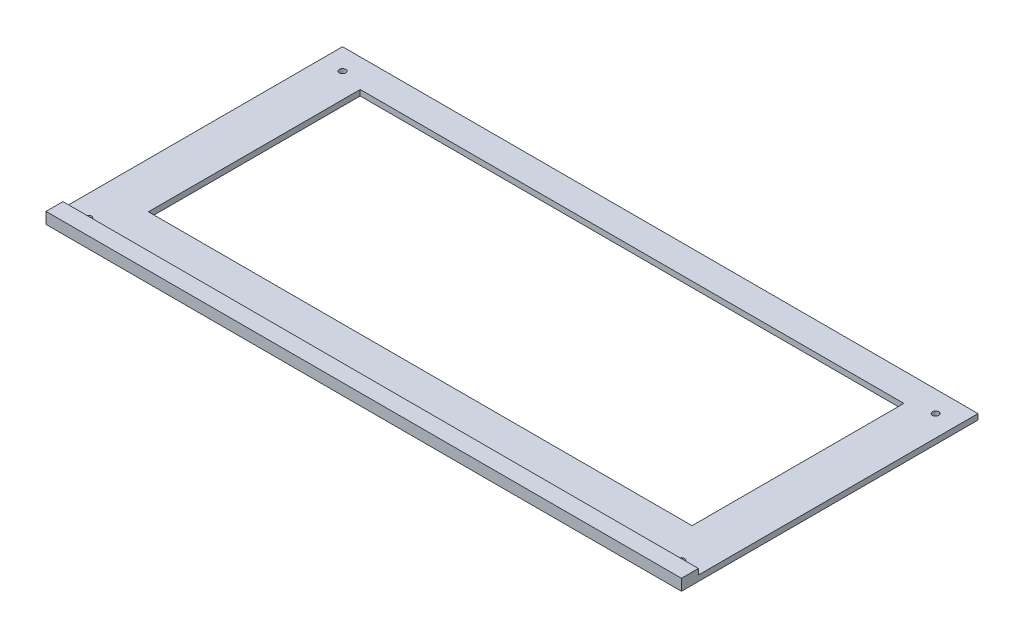
ISO-10303-21;
HEADER;
FILE_DESCRIPTION(('STEP AP214'),'2;1');
FILE_NAME('part.step','',(''),(''),'','','');
FILE_SCHEMA(('AUTOMOTIVE_DESIGN { 1 0 10303 214 1 1 1 1 }'));
ENDSEC;
DATA;
#1=APPLICATION_CONTEXT('core data for automotive mechanical design processes');
#2=APPLICATION_PROTOCOL_DEFINITION('international standard','automotive_design',2000,#1);
#3=PRODUCT_CONTEXT('',#1,'mechanical');
#4=PRODUCT('Part','Part','',(#3));
#5=PRODUCT_RELATED_PRODUCT_CATEGORY('part','',(#4));
#6=PRODUCT_DEFINITION_FORMATION('','',#4);
#7=PRODUCT_DEFINITION_CONTEXT('part definition',#1,'design');
#8=PRODUCT_DEFINITION('design','',#6,#7);
#9=PRODUCT_DEFINITION_SHAPE('','',#8);
#10=(LENGTH_UNIT() NAMED_UNIT(*) SI_UNIT(.MILLI.,.METRE.));
#11=(NAMED_UNIT(*) PLANE_ANGLE_UNIT() SI_UNIT($,.RADIAN.));
#12=(NAMED_UNIT(*) SI_UNIT($,.STERADIAN.) SOLID_ANGLE_UNIT());
#13=UNCERTAINTY_MEASURE_WITH_UNIT(LENGTH_MEASURE(1.E-05),#10,'distance_accuracy_value','');
#14=(GEOMETRIC_REPRESENTATION_CONTEXT(3) GLOBAL_UNCERTAINTY_ASSIGNED_CONTEXT((#13)) GLOBAL_UNIT_ASSIGNED_CONTEXT((#10,
#11,#12)) REPRESENTATION_CONTEXT('',''));
#15=CARTESIAN_POINT('',(0.,0.,0.));
#16=DIRECTION('',(0.,0.,1.));
#17=DIRECTION('',(1.,0.,0.));
#18=AXIS2_PLACEMENT_3D('',#15,#16,#17);
#19=CARTESIAN_POINT('',(0.,8.,0.));
#20=DIRECTION('',(0.,-1.,0.));
#21=DIRECTION('',(0.,0.,-1.));
#22=AXIS2_PLACEMENT_3D('',#19,#20,#21);
#23=PLANE('',#22);
#24=CARTESIAN_POINT('',(420.,8.,-180.));
#25=DIRECTION('',(0.,1.,0.));
#26=DIRECTION('',(0.,0.,1.));
#27=AXIS2_PLACEMENT_3D('',#24,#25,#26);
#28=CIRCLE('',#27,4.50000000000002);
#29=CARTESIAN_POINT('',(420.,8.,-175.5));
#30=VERTEX_POINT('',#29);
#31=EDGE_CURVE('E143',#30,#30,#28,.T.);
#32=ORIENTED_EDGE('',*,*,#31,.F.);
#33=EDGE_LOOP('',(#32));
#34=FACE_BOUND('',#33,.T.);
#35=CARTESIAN_POINT('',(-420.,8.,-180.));
#36=DIRECTION('',(0.,1.,0.));
#37=DIRECTION('',(0.,0.,1.));
#38=AXIS2_PLACEMENT_3D('',#35,#36,#37);
#39=CIRCLE('',#38,4.50000000000002);
#40=CARTESIAN_POINT('',(-420.,8.,-175.5));
#41=VERTEX_POINT('',#40);
#42=EDGE_CURVE('E149',#41,#41,#39,.T.);
#43=ORIENTED_EDGE('',*,*,#42,.F.);
#44=EDGE_LOOP('',(#43));
#45=FACE_BOUND('',#44,.T.);
#46=CARTESIAN_POINT('',(420.,8.,180.));
#47=DIRECTION('',(0.,1.,0.));
#48=DIRECTION('',(0.,0.,1.));
#49=AXIS2_PLACEMENT_3D('',#46,#47,#48);
#50=CIRCLE('',#49,4.50000000000002);
#51=CARTESIAN_POINT('',(420.,8.,184.5));
#52=VERTEX_POINT('',#51);
#53=EDGE_CURVE('E155',#52,#52,#50,.T.);
#54=ORIENTED_EDGE('',*,*,#53,.F.);
#55=EDGE_LOOP('',(#54));
#56=FACE_BOUND('',#55,.T.);
#57=CARTESIAN_POINT('',(-420.,8.,180.));
#58=DIRECTION('',(0.,1.,0.));
#59=DIRECTION('',(0.,0.,1.));
#60=AXIS2_PLACEMENT_3D('',#57,#58,#59);
#61=CIRCLE('',#60,4.50000000000002);
#62=CARTESIAN_POINT('',(-420.,8.,184.5));
#63=VERTEX_POINT('',#62);
#64=EDGE_CURVE('E161',#63,#63,#61,.T.);
#65=ORIENTED_EDGE('',*,*,#64,.F.);
#66=EDGE_LOOP('',(#65));
#67=FACE_BOUND('',#66,.T.);
#68=DIRECTION('',(0.,0.,-1.));
#69=VECTOR('',#68,1.);
#70=CARTESIAN_POINT('',(385.,8.,130.));
#71=LINE('',#70,#69);
#72=CARTESIAN_POINT('',(385.,8.,130.));
#73=VERTEX_POINT('',#72);
#74=CARTESIAN_POINT('',(385.,8.,-170.));
#75=VERTEX_POINT('',#74);
#76=EDGE_CURVE('E167',#73,#75,#71,.T.);
#77=ORIENTED_EDGE('',*,*,#76,.F.);
#78=DIRECTION('',(1.,0.,0.));
#79=VECTOR('',#78,1.);
#80=CARTESIAN_POINT('',(-385.,8.,130.));
#81=LINE('',#80,#79);
#82=CARTESIAN_POINT('',(-385.,8.,130.));
#83=VERTEX_POINT('',#82);
#84=EDGE_CURVE('E175',#83,#73,#81,.T.);
#85=ORIENTED_EDGE('',*,*,#84,.F.);
#86=DIRECTION('',(0.,0.,1.));
#87=VECTOR('',#86,1.);
#88=CARTESIAN_POINT('',(-385.,8.,130.));
#89=LINE('',#88,#87);
#90=CARTESIAN_POINT('',(-385.,8.,-170.));
#91=VERTEX_POINT('',#90);
#92=EDGE_CURVE('E172',#91,#83,#89,.T.);
#93=ORIENTED_EDGE('',*,*,#92,.F.);
#94=DIRECTION('',(-1.,0.,0.));
#95=VECTOR('',#94,1.);
#96=CARTESIAN_POINT('',(-385.,8.,-170.));
#97=LINE('',#96,#95);
#98=EDGE_CURVE('E169',#75,#91,#97,.T.);
#99=ORIENTED_EDGE('',*,*,#98,.F.);
#100=EDGE_LOOP('',(#77,#85,#93,#99));
#101=FACE_BOUND('',#100,.T.);
#102=DIRECTION('',(-1.,0.,0.));
#103=VECTOR('',#102,1.);
#104=CARTESIAN_POINT('',(0.,8.,186.));
#105=LINE('',#104,#103);
#106=CARTESIAN_POINT('',(450.,8.,186.));
#107=VERTEX_POINT('',#106);
#108=CARTESIAN_POINT('',(-450.,8.,186.));
#109=VERTEX_POINT('',#108);
#110=EDGE_CURVE('E54',#107,#109,#105,.T.);
#111=ORIENTED_EDGE('',*,*,#110,.F.);
#112=DIRECTION('',(0.,0.,-1.));
#113=VECTOR('',#112,1.);
#114=CARTESIAN_POINT('',(450.,8.,210.));
#115=LINE('',#114,#113);
#116=CARTESIAN_POINT('',(450.,8.,-210.));
#117=VERTEX_POINT('',#116);
#118=EDGE_CURVE('E136',#107,#117,#115,.T.);
#119=ORIENTED_EDGE('',*,*,#118,.T.);
#120=DIRECTION('',(-1.,0.,0.));
#121=VECTOR('',#120,1.);
#122=CARTESIAN_POINT('',(-450.,8.,-210.));
#123=LINE('',#122,#121);
#124=CARTESIAN_POINT('',(-450.,8.,-210.));
#125=VERTEX_POINT('',#124);
#126=EDGE_CURVE('E199',#117,#125,#123,.T.);
#127=ORIENTED_EDGE('',*,*,#126,.T.);
#128=DIRECTION('',(0.,0.,1.));
#129=VECTOR('',#128,1.);
#130=CARTESIAN_POINT('',(-450.,8.,210.));
#131=LINE('',#130,#129);
#132=EDGE_CURVE('E59',#125,#109,#131,.T.);
#133=ORIENTED_EDGE('',*,*,#132,.T.);
#134=EDGE_LOOP('',(#111,#119,#127,#133));
#135=FACE_BOUND('',#134,.T.);
#136=ADVANCED_FACE('F39',(#34,#45,#56,#67,#101,#135),#23,.F.);
#137=CARTESIAN_POINT('',(0.,0.,0.));
#138=DIRECTION('',(0.,-1.,0.));
#139=DIRECTION('',(0.,0.,-1.));
#140=AXIS2_PLACEMENT_3D('',#137,#138,#139);
#141=PLANE('',#140);
#142=DIRECTION('',(1.,0.,0.));
#143=VECTOR('',#142,1.);
#144=CARTESIAN_POINT('',(-450.,0.,210.));
#145=LINE('',#144,#143);
#146=CARTESIAN_POINT('',(-450.,0.,210.));
#147=VERTEX_POINT('',#146);
#148=CARTESIAN_POINT('',(450.,0.,210.));
#149=VERTEX_POINT('',#148);
#150=EDGE_CURVE('E200',#147,#149,#145,.T.);
#151=ORIENTED_EDGE('',*,*,#150,.F.);
#152=DIRECTION('',(0.,0.,1.));
#153=VECTOR('',#152,1.);
#154=CARTESIAN_POINT('',(-450.,0.,210.));
#155=LINE('',#154,#153);
#156=CARTESIAN_POINT('',(-450.,0.,-210.));
#157=VERTEX_POINT('',#156);
#158=EDGE_CURVE('E207',#157,#147,#155,.T.);
#159=ORIENTED_EDGE('',*,*,#158,.F.);
#160=DIRECTION('',(-1.,0.,0.));
#161=VECTOR('',#160,1.);
#162=CARTESIAN_POINT('',(-450.,0.,-210.));
#163=LINE('',#162,#161);
#164=CARTESIAN_POINT('',(450.,0.,-210.));
#165=VERTEX_POINT('',#164);
#166=EDGE_CURVE('E205',#165,#157,#163,.T.);
#167=ORIENTED_EDGE('',*,*,#166,.F.);
#168=DIRECTION('',(0.,0.,-1.));
#169=VECTOR('',#168,1.);
#170=CARTESIAN_POINT('',(450.,0.,210.));
#171=LINE('',#170,#169);
#172=EDGE_CURVE('E197',#149,#165,#171,.T.);
#173=ORIENTED_EDGE('',*,*,#172,.F.);
#174=EDGE_LOOP('',(#151,#159,#167,#173));
#175=FACE_BOUND('',#174,.T.);
#176=CARTESIAN_POINT('',(-420.,0.,-180.));
#177=DIRECTION('',(0.,1.,0.));
#178=DIRECTION('',(0.,0.,1.));
#179=AXIS2_PLACEMENT_3D('',#176,#177,#178);
#180=CIRCLE('',#179,4.50000000000002);
#181=CARTESIAN_POINT('',(-420.,0.,-175.5));
#182=VERTEX_POINT('',#181);
#183=EDGE_CURVE('E146',#182,#182,#180,.T.);
#184=ORIENTED_EDGE('',*,*,#183,.T.);
#185=EDGE_LOOP('',(#184));
#186=FACE_BOUND('',#185,.T.);
#187=CARTESIAN_POINT('',(-420.,0.,180.));
#188=DIRECTION('',(0.,1.,0.));
#189=DIRECTION('',(0.,0.,1.));
#190=AXIS2_PLACEMENT_3D('',#187,#188,#189);
#191=CIRCLE('',#190,4.50000000000002);
#192=CARTESIAN_POINT('',(-420.,0.,184.5));
#193=VERTEX_POINT('',#192);
#194=EDGE_CURVE('E158',#193,#193,#191,.T.);
#195=ORIENTED_EDGE('',*,*,#194,.T.);
#196=EDGE_LOOP('',(#195));
#197=FACE_BOUND('',#196,.T.);
#198=DIRECTION('',(1.,0.,0.));
#199=VECTOR('',#198,1.);
#200=CARTESIAN_POINT('',(-385.,0.,130.));
#201=LINE('',#200,#199);
#202=CARTESIAN_POINT('',(-385.,0.,130.));
#203=VERTEX_POINT('',#202);
#204=CARTESIAN_POINT('',(385.,0.,130.));
#205=VERTEX_POINT('',#204);
#206=EDGE_CURVE('E170',#203,#205,#201,.T.);
#207=ORIENTED_EDGE('',*,*,#206,.T.);
#208=DIRECTION('',(0.,0.,-1.));
#209=VECTOR('',#208,1.);
#210=CARTESIAN_POINT('',(385.,0.,130.));
#211=LINE('',#210,#209);
#212=CARTESIAN_POINT('',(385.,0.,-170.));
#213=VERTEX_POINT('',#212);
#214=EDGE_CURVE('E164',#205,#213,#211,.T.);
#215=ORIENTED_EDGE('',*,*,#214,.T.);
#216=DIRECTION('',(-1.,0.,0.));
#217=VECTOR('',#216,1.);
#218=CARTESIAN_POINT('',(-385.,0.,-170.));
#219=LINE('',#218,#217);
#220=CARTESIAN_POINT('',(-385.,0.,-170.));
#221=VERTEX_POINT('',#220);
#222=EDGE_CURVE('E180',#213,#221,#219,.T.);
#223=ORIENTED_EDGE('',*,*,#222,.T.);
#224=DIRECTION('',(0.,0.,1.));
#225=VECTOR('',#224,1.);
#226=CARTESIAN_POINT('',(-385.,0.,130.));
#227=LINE('',#226,#225);
#228=EDGE_CURVE('E183',#221,#203,#227,.T.);
#229=ORIENTED_EDGE('',*,*,#228,.T.);
#230=EDGE_LOOP('',(#207,#215,#223,#229));
#231=FACE_BOUND('',#230,.T.);
#232=CARTESIAN_POINT('',(420.,0.,180.));
#233=DIRECTION('',(0.,1.,0.));
#234=DIRECTION('',(0.,0.,1.));
#235=AXIS2_PLACEMENT_3D('',#232,#233,#234);
#236=CIRCLE('',#235,4.50000000000002);
#237=CARTESIAN_POINT('',(420.,0.,184.5));
#238=VERTEX_POINT('',#237);
#239=EDGE_CURVE('E152',#238,#238,#236,.T.);
#240=ORIENTED_EDGE('',*,*,#239,.T.);
#241=EDGE_LOOP('',(#240));
#242=FACE_BOUND('',#241,.T.);
#243=CARTESIAN_POINT('',(420.,0.,-180.));
#244=DIRECTION('',(0.,1.,0.));
#245=DIRECTION('',(0.,0.,1.));
#246=AXIS2_PLACEMENT_3D('',#243,#244,#245);
#247=CIRCLE('',#246,4.50000000000002);
#248=CARTESIAN_POINT('',(420.,0.,-175.5));
#249=VERTEX_POINT('',#248);
#250=EDGE_CURVE('E138',#249,#249,#247,.T.);
#251=ORIENTED_EDGE('',*,*,#250,.T.);
#252=EDGE_LOOP('',(#251));
#253=FACE_BOUND('',#252,.T.);
#254=ADVANCED_FACE('F223',(#175,#186,#197,#231,#242,#253),#141,.T.);
#255=CARTESIAN_POINT('',(450.,8.,210.));
#256=DIRECTION('',(-1.,0.,0.));
#257=DIRECTION('',(0.,0.,1.));
#258=AXIS2_PLACEMENT_3D('',#255,#256,#257);
#259=PLANE('',#258);
#260=ORIENTED_EDGE('',*,*,#172,.T.);
#261=DIRECTION('',(0.,-1.,0.));
#262=VECTOR('',#261,1.);
#263=CARTESIAN_POINT('',(450.,8.,-210.));
#264=LINE('',#263,#262);
#265=EDGE_CURVE('E11',#117,#165,#264,.T.);
#266=ORIENTED_EDGE('',*,*,#265,.F.);
#267=ORIENTED_EDGE('',*,*,#118,.F.);
#268=DIRECTION('',(0.,-1.,0.));
#269=VECTOR('',#268,1.);
#270=CARTESIAN_POINT('',(450.,16.,186.));
#271=LINE('',#270,#269);
#272=CARTESIAN_POINT('',(450.,16.,186.));
#273=VERTEX_POINT('',#272);
#274=EDGE_CURVE('E118',#273,#107,#271,.T.);
#275=ORIENTED_EDGE('',*,*,#274,.F.);
#276=DIRECTION('',(0.,0.,-1.));
#277=VECTOR('',#276,1.);
#278=CARTESIAN_POINT('',(450.,16.,210.));
#279=LINE('',#278,#277);
#280=CARTESIAN_POINT('',(450.,16.,210.));
#281=VERTEX_POINT('',#280);
#282=EDGE_CURVE('E125',#281,#273,#279,.T.);
#283=ORIENTED_EDGE('',*,*,#282,.F.);
#284=DIRECTION('',(0.,-1.,0.));
#285=VECTOR('',#284,1.);
#286=CARTESIAN_POINT('',(450.,8.,210.));
#287=LINE('',#286,#285);
#288=EDGE_CURVE('E203',#281,#149,#287,.T.);
#289=ORIENTED_EDGE('',*,*,#288,.T.);
#290=EDGE_LOOP('',(#260,#266,#267,#275,#283,#289));
#291=FACE_BOUND('',#290,.T.);
#292=ADVANCED_FACE('F41',(#291),#259,.F.);
#293=CARTESIAN_POINT('',(-450.,8.,-210.));
#294=DIRECTION('',(0.,0.,1.));
#295=DIRECTION('',(1.,0.,0.));
#296=AXIS2_PLACEMENT_3D('',#293,#294,#295);
#297=PLANE('',#296);
#298=ORIENTED_EDGE('',*,*,#166,.T.);
#299=DIRECTION('',(0.,-1.,0.));
#300=VECTOR('',#299,1.);
#301=CARTESIAN_POINT('',(-450.,8.,-210.));
#302=LINE('',#301,#300);
#303=EDGE_CURVE('E47',#125,#157,#302,.T.);
#304=ORIENTED_EDGE('',*,*,#303,.F.);
#305=ORIENTED_EDGE('',*,*,#126,.F.);
#306=ORIENTED_EDGE('',*,*,#265,.T.);
#307=EDGE_LOOP('',(#298,#304,#305,#306));
#308=FACE_BOUND('',#307,.T.);
#309=ADVANCED_FACE('F228',(#308),#297,.F.);
#310=CARTESIAN_POINT('',(-450.,8.,210.));
#311=DIRECTION('',(1.,0.,0.));
#312=DIRECTION('',(0.,0.,-1.));
#313=AXIS2_PLACEMENT_3D('',#310,#311,#312);
#314=PLANE('',#313);
#315=DIRECTION('',(0.,-1.,0.));
#316=VECTOR('',#315,1.);
#317=CARTESIAN_POINT('',(-450.,8.,210.));
#318=LINE('',#317,#316);
#319=CARTESIAN_POINT('',(-450.,16.,210.));
#320=VERTEX_POINT('',#319);
#321=EDGE_CURVE('E211',#320,#147,#318,.T.);
#322=ORIENTED_EDGE('',*,*,#321,.F.);
#323=DIRECTION('',(0.,0.,1.));
#324=VECTOR('',#323,1.);
#325=CARTESIAN_POINT('',(-450.,16.,210.));
#326=LINE('',#325,#324);
#327=CARTESIAN_POINT('',(-450.,16.,186.));
#328=VERTEX_POINT('',#327);
#329=EDGE_CURVE('E124',#328,#320,#326,.T.);
#330=ORIENTED_EDGE('',*,*,#329,.F.);
#331=DIRECTION('',(0.,-1.,0.));
#332=VECTOR('',#331,1.);
#333=CARTESIAN_POINT('',(-450.,16.,186.));
#334=LINE('',#333,#332);
#335=EDGE_CURVE('E120',#328,#109,#334,.T.);
#336=ORIENTED_EDGE('',*,*,#335,.T.);
#337=ORIENTED_EDGE('',*,*,#132,.F.);
#338=ORIENTED_EDGE('',*,*,#303,.T.);
#339=ORIENTED_EDGE('',*,*,#158,.T.);
#340=EDGE_LOOP('',(#322,#330,#336,#337,#338,#339));
#341=FACE_BOUND('',#340,.T.);
#342=ADVANCED_FACE('F217',(#341),#314,.F.);
#343=CARTESIAN_POINT('',(-450.,8.,210.));
#344=DIRECTION('',(0.,0.,-1.));
#345=DIRECTION('',(-1.,0.,0.));
#346=AXIS2_PLACEMENT_3D('',#343,#344,#345);
#347=PLANE('',#346);
#348=ORIENTED_EDGE('',*,*,#150,.T.);
#349=ORIENTED_EDGE('',*,*,#288,.F.);
#350=DIRECTION('',(1.,0.,0.));
#351=VECTOR('',#350,1.);
#352=CARTESIAN_POINT('',(-450.,16.,210.));
#353=LINE('',#352,#351);
#354=EDGE_CURVE('E131',#320,#281,#353,.T.);
#355=ORIENTED_EDGE('',*,*,#354,.F.);
#356=ORIENTED_EDGE('',*,*,#321,.T.);
#357=EDGE_LOOP('',(#348,#349,#355,#356));
#358=FACE_BOUND('',#357,.T.);
#359=ADVANCED_FACE('F227',(#358),#347,.F.);
#360=CARTESIAN_POINT('',(385.,8.,130.));
#361=DIRECTION('',(-1.,0.,0.));
#362=DIRECTION('',(0.,0.,1.));
#363=AXIS2_PLACEMENT_3D('',#360,#361,#362);
#364=PLANE('',#363);
#365=ORIENTED_EDGE('',*,*,#214,.F.);
#366=DIRECTION('',(0.,-1.,0.));
#367=VECTOR('',#366,1.);
#368=CARTESIAN_POINT('',(385.,8.,130.));
#369=LINE('',#368,#367);
#370=EDGE_CURVE('E177',#73,#205,#369,.T.);
#371=ORIENTED_EDGE('',*,*,#370,.F.);
#372=ORIENTED_EDGE('',*,*,#76,.T.);
#373=DIRECTION('',(0.,-1.,0.));
#374=VECTOR('',#373,1.);
#375=CARTESIAN_POINT('',(385.,8.,-170.));
#376=LINE('',#375,#374);
#377=EDGE_CURVE('E194',#75,#213,#376,.T.);
#378=ORIENTED_EDGE('',*,*,#377,.T.);
#379=EDGE_LOOP('',(#365,#371,#372,#378));
#380=FACE_BOUND('',#379,.T.);
#381=ADVANCED_FACE('F239',(#380),#364,.T.);
#382=CARTESIAN_POINT('',(-385.,8.,-170.));
#383=DIRECTION('',(0.,0.,1.));
#384=DIRECTION('',(1.,0.,0.));
#385=AXIS2_PLACEMENT_3D('',#382,#383,#384);
#386=PLANE('',#385);
#387=ORIENTED_EDGE('',*,*,#222,.F.);
#388=ORIENTED_EDGE('',*,*,#377,.F.);
#389=ORIENTED_EDGE('',*,*,#98,.T.);
#390=DIRECTION('',(0.,-1.,0.));
#391=VECTOR('',#390,1.);
#392=CARTESIAN_POINT('',(-385.,8.,-170.));
#393=LINE('',#392,#391);
#394=EDGE_CURVE('E192',#91,#221,#393,.T.);
#395=ORIENTED_EDGE('',*,*,#394,.T.);
#396=EDGE_LOOP('',(#387,#388,#389,#395));
#397=FACE_BOUND('',#396,.T.);
#398=ADVANCED_FACE('F329',(#397),#386,.T.);
#399=CARTESIAN_POINT('',(-385.,8.,130.));
#400=DIRECTION('',(1.,0.,0.));
#401=DIRECTION('',(0.,0.,-1.));
#402=AXIS2_PLACEMENT_3D('',#399,#400,#401);
#403=PLANE('',#402);
#404=ORIENTED_EDGE('',*,*,#228,.F.);
#405=ORIENTED_EDGE('',*,*,#394,.F.);
#406=ORIENTED_EDGE('',*,*,#92,.T.);
#407=DIRECTION('',(0.,-1.,0.));
#408=VECTOR('',#407,1.);
#409=CARTESIAN_POINT('',(-385.,8.,130.));
#410=LINE('',#409,#408);
#411=EDGE_CURVE('E190',#83,#203,#410,.T.);
#412=ORIENTED_EDGE('',*,*,#411,.T.);
#413=EDGE_LOOP('',(#404,#405,#406,#412));
#414=FACE_BOUND('',#413,.T.);
#415=ADVANCED_FACE('F318',(#414),#403,.T.);
#416=CARTESIAN_POINT('',(-385.,8.,130.));
#417=DIRECTION('',(0.,0.,-1.));
#418=DIRECTION('',(-1.,0.,0.));
#419=AXIS2_PLACEMENT_3D('',#416,#417,#418);
#420=PLANE('',#419);
#421=ORIENTED_EDGE('',*,*,#206,.F.);
#422=ORIENTED_EDGE('',*,*,#411,.F.);
#423=ORIENTED_EDGE('',*,*,#84,.T.);
#424=ORIENTED_EDGE('',*,*,#370,.T.);
#425=EDGE_LOOP('',(#421,#422,#423,#424));
#426=FACE_BOUND('',#425,.T.);
#427=ADVANCED_FACE('F307',(#426),#420,.T.);
#428=CARTESIAN_POINT('',(-420.,8.,180.));
#429=DIRECTION('',(0.,-1.,0.));
#430=DIRECTION('',(0.,0.,-1.));
#431=AXIS2_PLACEMENT_3D('',#428,#429,#430);
#432=CYLINDRICAL_SURFACE('',#431,4.50000000000002);
#433=ORIENTED_EDGE('',*,*,#64,.T.);
#434=EDGE_LOOP('',(#433));
#435=FACE_BOUND('',#434,.T.);
#436=ORIENTED_EDGE('',*,*,#194,.F.);
#437=EDGE_LOOP('',(#436));
#438=FACE_BOUND('',#437,.T.);
#439=ADVANCED_FACE('F296',(#435,#438),#432,.F.);
#440=CARTESIAN_POINT('',(420.,8.,180.));
#441=DIRECTION('',(0.,-1.,0.));
#442=DIRECTION('',(0.,0.,-1.));
#443=AXIS2_PLACEMENT_3D('',#440,#441,#442);
#444=CYLINDRICAL_SURFACE('',#443,4.50000000000002);
#445=ORIENTED_EDGE('',*,*,#53,.T.);
#446=EDGE_LOOP('',(#445));
#447=FACE_BOUND('',#446,.T.);
#448=ORIENTED_EDGE('',*,*,#239,.F.);
#449=EDGE_LOOP('',(#448));
#450=FACE_BOUND('',#449,.T.);
#451=ADVANCED_FACE('F285',(#447,#450),#444,.F.);
#452=CARTESIAN_POINT('',(-420.,8.,-180.));
#453=DIRECTION('',(0.,-1.,0.));
#454=DIRECTION('',(0.,0.,-1.));
#455=AXIS2_PLACEMENT_3D('',#452,#453,#454);
#456=CYLINDRICAL_SURFACE('',#455,4.50000000000002);
#457=ORIENTED_EDGE('',*,*,#42,.T.);
#458=EDGE_LOOP('',(#457));
#459=FACE_BOUND('',#458,.T.);
#460=ORIENTED_EDGE('',*,*,#183,.F.);
#461=EDGE_LOOP('',(#460));
#462=FACE_BOUND('',#461,.T.);
#463=ADVANCED_FACE('F274',(#459,#462),#456,.F.);
#464=CARTESIAN_POINT('',(420.,8.,-180.));
#465=DIRECTION('',(0.,-1.,0.));
#466=DIRECTION('',(0.,0.,-1.));
#467=AXIS2_PLACEMENT_3D('',#464,#465,#466);
#468=CYLINDRICAL_SURFACE('',#467,4.50000000000002);
#469=ORIENTED_EDGE('',*,*,#31,.T.);
#470=EDGE_LOOP('',(#469));
#471=FACE_BOUND('',#470,.T.);
#472=ORIENTED_EDGE('',*,*,#250,.F.);
#473=EDGE_LOOP('',(#472));
#474=FACE_BOUND('',#473,.T.);
#475=ADVANCED_FACE('F269',(#471,#474),#468,.F.);
#476=CARTESIAN_POINT('',(-450.,16.,186.));
#477=DIRECTION('',(0.,0.,1.));
#478=DIRECTION('',(1.,0.,0.));
#479=AXIS2_PLACEMENT_3D('',#476,#477,#478);
#480=PLANE('',#479);
#481=ORIENTED_EDGE('',*,*,#274,.T.);
#482=ORIENTED_EDGE('',*,*,#110,.T.);
#483=ORIENTED_EDGE('',*,*,#335,.F.);
#484=DIRECTION('',(-1.,0.,0.));
#485=VECTOR('',#484,1.);
#486=CARTESIAN_POINT('',(-450.,16.,186.));
#487=LINE('',#486,#485);
#488=EDGE_CURVE('E114',#273,#328,#487,.T.);
#489=ORIENTED_EDGE('',*,*,#488,.F.);
#490=EDGE_LOOP('',(#481,#482,#483,#489));
#491=FACE_BOUND('',#490,.T.);
#492=ADVANCED_FACE('F116',(#491),#480,.F.);
#493=CARTESIAN_POINT('',(0.,16.,0.));
#494=DIRECTION('',(0.,-1.,0.));
#495=DIRECTION('',(0.,0.,-1.));
#496=AXIS2_PLACEMENT_3D('',#493,#494,#495);
#497=PLANE('',#496);
#498=ORIENTED_EDGE('',*,*,#282,.T.);
#499=ORIENTED_EDGE('',*,*,#488,.T.);
#500=ORIENTED_EDGE('',*,*,#329,.T.);
#501=ORIENTED_EDGE('',*,*,#354,.T.);
#502=EDGE_LOOP('',(#498,#499,#500,#501));
#503=FACE_BOUND('',#502,.T.);
#504=ADVANCED_FACE('F129',(#503),#497,.F.);
#505=CLOSED_SHELL('',(#136,#254,#292,#309,#342,#359,#381,#398,#415,#427,#439,#451,#463,#475,
#492,#504));
#506=MANIFOLD_SOLID_BREP('B2',#505);
#507=ADVANCED_BREP_SHAPE_REPRESENTATION('',(#18,#506),#14);
#508=SHAPE_DEFINITION_REPRESENTATION(#9,#507);
ENDSEC;
END-ISO-10303-21;
